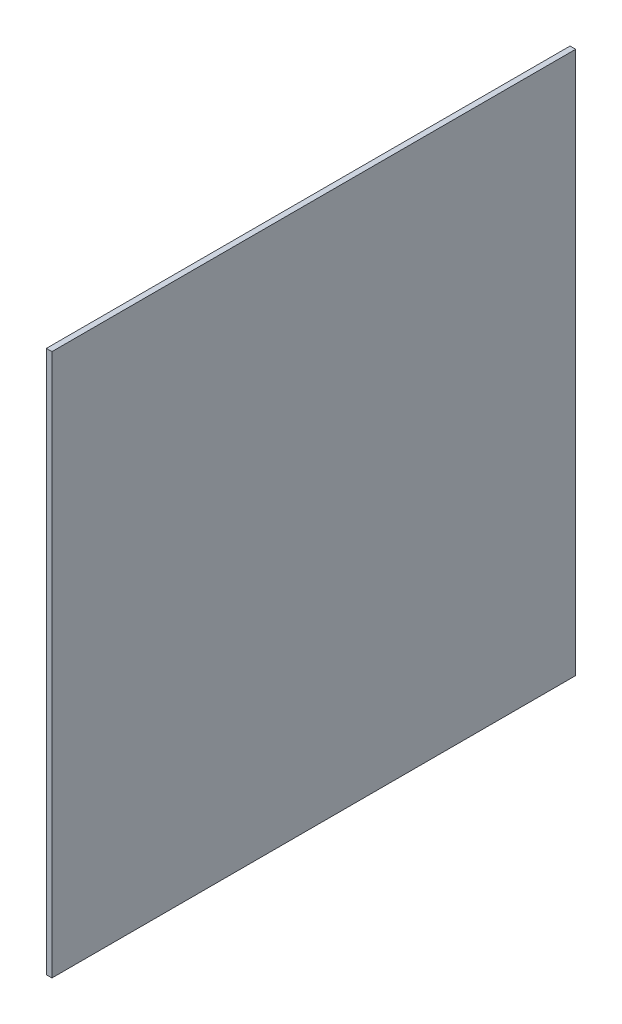
ISO-10303-21;
HEADER;
FILE_DESCRIPTION(('STEP AP214'),'2;1');
FILE_NAME('part.step','',(''),(''),'','','');
FILE_SCHEMA(('AUTOMOTIVE_DESIGN { 1 0 10303 214 1 1 1 1 }'));
ENDSEC;
DATA;
#1=APPLICATION_CONTEXT('core data for automotive mechanical design processes');
#2=APPLICATION_PROTOCOL_DEFINITION('international standard','automotive_design',2000,#1);
#3=PRODUCT_CONTEXT('',#1,'mechanical');
#4=PRODUCT('Part','Part','',(#3));
#5=PRODUCT_RELATED_PRODUCT_CATEGORY('part','',(#4));
#6=PRODUCT_DEFINITION_FORMATION('','',#4);
#7=PRODUCT_DEFINITION_CONTEXT('part definition',#1,'design');
#8=PRODUCT_DEFINITION('design','',#6,#7);
#9=PRODUCT_DEFINITION_SHAPE('','',#8);
#10=(LENGTH_UNIT() NAMED_UNIT(*) SI_UNIT(.MILLI.,.METRE.));
#11=(NAMED_UNIT(*) PLANE_ANGLE_UNIT() SI_UNIT($,.RADIAN.));
#12=(NAMED_UNIT(*) SI_UNIT($,.STERADIAN.) SOLID_ANGLE_UNIT());
#13=UNCERTAINTY_MEASURE_WITH_UNIT(LENGTH_MEASURE(1.E-05),#10,'distance_accuracy_value','');
#14=(GEOMETRIC_REPRESENTATION_CONTEXT(3) GLOBAL_UNCERTAINTY_ASSIGNED_CONTEXT((#13)) GLOBAL_UNIT_ASSIGNED_CONTEXT((#10,
#11,#12)) REPRESENTATION_CONTEXT('',''));
#15=CARTESIAN_POINT('',(0.,0.,0.));
#16=DIRECTION('',(0.,0.,1.));
#17=DIRECTION('',(1.,0.,0.));
#18=AXIS2_PLACEMENT_3D('',#15,#16,#17);
#19=CARTESIAN_POINT('',(3.,37.9624626991459,46.7551319464589));
#20=DIRECTION('',(0.,0.,-1.));
#21=DIRECTION('',(0.,1.,0.));
#22=AXIS2_PLACEMENT_3D('',#19,#20,#21);
#23=PLANE('',#22);
#24=DIRECTION('',(0.,-1.,0.));
#25=VECTOR('',#24,1.);
#26=CARTESIAN_POINT('',(0.,37.9624626991459,46.7551319464589));
#27=LINE('',#26,#25);
#28=CARTESIAN_POINT('',(0.,37.9624626991459,46.7551319464589));
#29=VERTEX_POINT('',#28);
#30=CARTESIAN_POINT('',(0.,-252.037537300854,46.7551319464589));
#31=VERTEX_POINT('',#30);
#32=EDGE_CURVE('E104',#29,#31,#27,.T.);
#33=ORIENTED_EDGE('',*,*,#32,.T.);
#34=DIRECTION('',(-1.,0.,0.));
#35=VECTOR('',#34,1.);
#36=CARTESIAN_POINT('',(3.,-252.037537300854,46.7551319464589));
#37=LINE('',#36,#35);
#38=CARTESIAN_POINT('',(3.,-252.037537300854,46.7551319464589));
#39=VERTEX_POINT('',#38);
#40=EDGE_CURVE('E11',#39,#31,#37,.T.);
#41=ORIENTED_EDGE('',*,*,#40,.F.);
#42=DIRECTION('',(0.,-1.,0.));
#43=VECTOR('',#42,1.);
#44=CARTESIAN_POINT('',(3.,37.9624626991459,46.7551319464589));
#45=LINE('',#44,#43);
#46=CARTESIAN_POINT('',(3.,37.9624626991459,46.7551319464589));
#47=VERTEX_POINT('',#46);
#48=EDGE_CURVE('E92',#47,#39,#45,.T.);
#49=ORIENTED_EDGE('',*,*,#48,.F.);
#50=DIRECTION('',(-1.,0.,0.));
#51=VECTOR('',#50,1.);
#52=CARTESIAN_POINT('',(3.,37.9624626991459,46.7551319464589));
#53=LINE('',#52,#51);
#54=EDGE_CURVE('E100',#47,#29,#53,.T.);
#55=ORIENTED_EDGE('',*,*,#54,.T.);
#56=EDGE_LOOP('',(#33,#41,#49,#55));
#57=FACE_BOUND('',#56,.T.);
#58=ADVANCED_FACE('F41',(#57),#23,.F.);
#59=CARTESIAN_POINT('',(3.,-252.037537300854,46.7551319464589));
#60=DIRECTION('',(0.,1.,0.));
#61=DIRECTION('',(0.,0.,1.));
#62=AXIS2_PLACEMENT_3D('',#59,#60,#61);
#63=PLANE('',#62);
#64=DIRECTION('',(0.,0.,-1.));
#65=VECTOR('',#64,1.);
#66=CARTESIAN_POINT('',(0.,-252.037537300854,46.7551319464589));
#67=LINE('',#66,#65);
#68=CARTESIAN_POINT('',(0.,-252.037537300854,-233.244868053541));
#69=VERTEX_POINT('',#68);
#70=EDGE_CURVE('E96',#31,#69,#67,.T.);
#71=ORIENTED_EDGE('',*,*,#70,.T.);
#72=DIRECTION('',(-1.,0.,0.));
#73=VECTOR('',#72,1.);
#74=CARTESIAN_POINT('',(3.,-252.037537300854,-233.244868053541));
#75=LINE('',#74,#73);
#76=CARTESIAN_POINT('',(3.,-252.037537300854,-233.244868053541));
#77=VERTEX_POINT('',#76);
#78=EDGE_CURVE('E49',#77,#69,#75,.T.);
#79=ORIENTED_EDGE('',*,*,#78,.F.);
#80=DIRECTION('',(0.,0.,-1.));
#81=VECTOR('',#80,1.);
#82=CARTESIAN_POINT('',(3.,-252.037537300854,46.7551319464589));
#83=LINE('',#82,#81);
#84=EDGE_CURVE('E87',#39,#77,#83,.T.);
#85=ORIENTED_EDGE('',*,*,#84,.F.);
#86=ORIENTED_EDGE('',*,*,#40,.T.);
#87=EDGE_LOOP('',(#71,#79,#85,#86));
#88=FACE_BOUND('',#87,.T.);
#89=ADVANCED_FACE('F95',(#88),#63,.F.);
#90=CARTESIAN_POINT('',(3.,37.9624626991459,-233.244868053541));
#91=DIRECTION('',(0.,0.,1.));
#92=DIRECTION('',(0.,-1.,0.));
#93=AXIS2_PLACEMENT_3D('',#90,#91,#92);
#94=PLANE('',#93);
#95=DIRECTION('',(0.,1.,0.));
#96=VECTOR('',#95,1.);
#97=CARTESIAN_POINT('',(0.,37.9624626991459,-233.244868053541));
#98=LINE('',#97,#96);
#99=CARTESIAN_POINT('',(0.,37.9624626991459,-233.244868053541));
#100=VERTEX_POINT('',#99);
#101=EDGE_CURVE('E74',#69,#100,#98,.T.);
#102=ORIENTED_EDGE('',*,*,#101,.T.);
#103=DIRECTION('',(-1.,0.,0.));
#104=VECTOR('',#103,1.);
#105=CARTESIAN_POINT('',(3.,37.9624626991459,-233.244868053541));
#106=LINE('',#105,#104);
#107=CARTESIAN_POINT('',(3.,37.9624626991459,-233.244868053541));
#108=VERTEX_POINT('',#107);
#109=EDGE_CURVE('E97',#108,#100,#106,.T.);
#110=ORIENTED_EDGE('',*,*,#109,.F.);
#111=DIRECTION('',(0.,1.,0.));
#112=VECTOR('',#111,1.);
#113=CARTESIAN_POINT('',(3.,37.9624626991459,-233.244868053541));
#114=LINE('',#113,#112);
#115=EDGE_CURVE('E90',#77,#108,#114,.T.);
#116=ORIENTED_EDGE('',*,*,#115,.F.);
#117=ORIENTED_EDGE('',*,*,#78,.T.);
#118=EDGE_LOOP('',(#102,#110,#116,#117));
#119=FACE_BOUND('',#118,.T.);
#120=ADVANCED_FACE('F98',(#119),#94,.F.);
#121=CARTESIAN_POINT('',(3.,37.9624626991459,46.7551319464589));
#122=DIRECTION('',(0.,-1.,0.));
#123=DIRECTION('',(0.,0.,-1.));
#124=AXIS2_PLACEMENT_3D('',#121,#122,#123);
#125=PLANE('',#124);
#126=DIRECTION('',(0.,0.,1.));
#127=VECTOR('',#126,1.);
#128=CARTESIAN_POINT('',(0.,37.9624626991459,46.7551319464589));
#129=LINE('',#128,#127);
#130=EDGE_CURVE('E80',#100,#29,#129,.T.);
#131=ORIENTED_EDGE('',*,*,#130,.T.);
#132=ORIENTED_EDGE('',*,*,#54,.F.);
#133=DIRECTION('',(0.,0.,1.));
#134=VECTOR('',#133,1.);
#135=CARTESIAN_POINT('',(3.,37.9624626991459,46.7551319464589));
#136=LINE('',#135,#134);
#137=EDGE_CURVE('E57',#108,#47,#136,.T.);
#138=ORIENTED_EDGE('',*,*,#137,.F.);
#139=ORIENTED_EDGE('',*,*,#109,.T.);
#140=EDGE_LOOP('',(#131,#132,#138,#139));
#141=FACE_BOUND('',#140,.T.);
#142=ADVANCED_FACE('F111',(#141),#125,.F.);
#143=CARTESIAN_POINT('',(3.,0.,0.));
#144=DIRECTION('',(1.,0.,0.));
#145=DIRECTION('',(0.,0.,-1.));
#146=AXIS2_PLACEMENT_3D('',#143,#144,#145);
#147=PLANE('',#146);
#148=ORIENTED_EDGE('',*,*,#48,.T.);
#149=ORIENTED_EDGE('',*,*,#84,.T.);
#150=ORIENTED_EDGE('',*,*,#115,.T.);
#151=ORIENTED_EDGE('',*,*,#137,.T.);
#152=EDGE_LOOP('',(#148,#149,#150,#151));
#153=FACE_BOUND('',#152,.T.);
#154=ADVANCED_FACE('F88',(#153),#147,.T.);
#155=CARTESIAN_POINT('',(0.,0.,0.));
#156=DIRECTION('',(1.,0.,0.));
#157=DIRECTION('',(0.,0.,-1.));
#158=AXIS2_PLACEMENT_3D('',#155,#156,#157);
#159=PLANE('',#158);
#160=ORIENTED_EDGE('',*,*,#32,.F.);
#161=ORIENTED_EDGE('',*,*,#130,.F.);
#162=ORIENTED_EDGE('',*,*,#101,.F.);
#163=ORIENTED_EDGE('',*,*,#70,.F.);
#164=EDGE_LOOP('',(#160,#161,#162,#163));
#165=FACE_BOUND('',#164,.T.);
#166=ADVANCED_FACE('F114',(#165),#159,.F.);
#167=CLOSED_SHELL('',(#58,#89,#120,#142,#154,#166));
#168=MANIFOLD_SOLID_BREP('B2',#167);
#169=ADVANCED_BREP_SHAPE_REPRESENTATION('',(#18,#168),#14);
#170=SHAPE_DEFINITION_REPRESENTATION(#9,#169);
ENDSEC;
END-ISO-10303-21;
